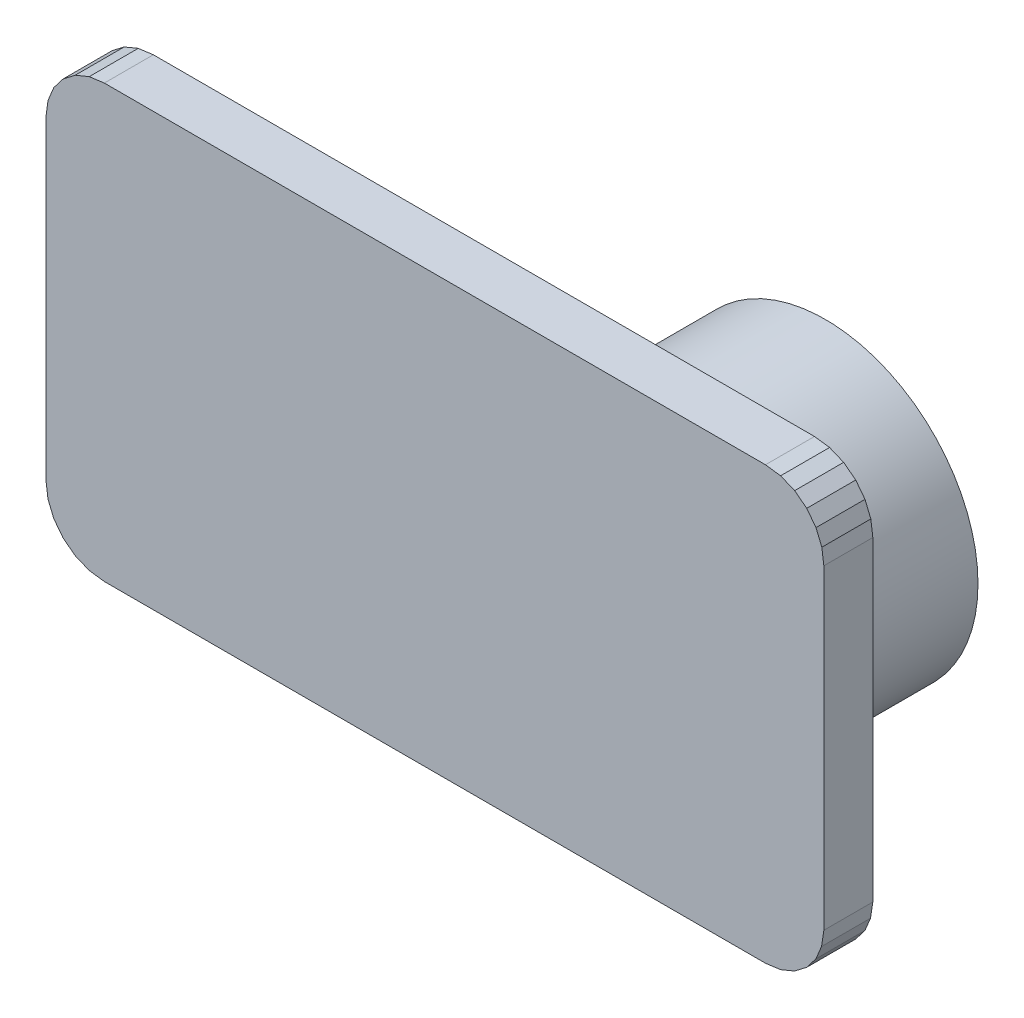
ISO-10303-21;
HEADER;
FILE_DESCRIPTION(('STEP AP214'),'2;1');
FILE_NAME('part.step','',(''),(''),'','','');
FILE_SCHEMA(('AUTOMOTIVE_DESIGN { 1 0 10303 214 1 1 1 1 }'));
ENDSEC;
DATA;
#1=APPLICATION_CONTEXT('core data for automotive mechanical design processes');
#2=APPLICATION_PROTOCOL_DEFINITION('international standard','automotive_design',2000,#1);
#3=PRODUCT_CONTEXT('',#1,'mechanical');
#4=PRODUCT('Part','Part','',(#3));
#5=PRODUCT_RELATED_PRODUCT_CATEGORY('part','',(#4));
#6=PRODUCT_DEFINITION_FORMATION('','',#4);
#7=PRODUCT_DEFINITION_CONTEXT('part definition',#1,'design');
#8=PRODUCT_DEFINITION('design','',#6,#7);
#9=PRODUCT_DEFINITION_SHAPE('','',#8);
#10=(LENGTH_UNIT() NAMED_UNIT(*) SI_UNIT(.MILLI.,.METRE.));
#11=(NAMED_UNIT(*) PLANE_ANGLE_UNIT() SI_UNIT($,.RADIAN.));
#12=(NAMED_UNIT(*) SI_UNIT($,.STERADIAN.) SOLID_ANGLE_UNIT());
#13=UNCERTAINTY_MEASURE_WITH_UNIT(LENGTH_MEASURE(1.E-05),#10,'distance_accuracy_value','');
#14=(GEOMETRIC_REPRESENTATION_CONTEXT(3) GLOBAL_UNCERTAINTY_ASSIGNED_CONTEXT((#13)) GLOBAL_UNIT_ASSIGNED_CONTEXT((#10,
#11,#12)) REPRESENTATION_CONTEXT('',''));
#15=CARTESIAN_POINT('',(0.,0.,0.));
#16=DIRECTION('',(0.,0.,1.));
#17=DIRECTION('',(1.,0.,0.));
#18=AXIS2_PLACEMENT_3D('',#15,#16,#17);
#19=CARTESIAN_POINT('',(0.,0.,0.));
#20=DIRECTION('',(0.,0.,1.));
#21=DIRECTION('',(1.,0.,0.));
#22=AXIS2_PLACEMENT_3D('',#19,#20,#21);
#23=PLANE('',#22);
#24=DIRECTION('',(-0.130525670530028,-0.991444930055465,0.));
#25=VECTOR('',#24,1.);
#26=CARTESIAN_POINT('',(0.064911,12.68505,0.));
#27=LINE('',#26,#25);
#28=CARTESIAN_POINT('',(0.064911,12.68505,0.));
#29=VERTEX_POINT('',#28);
#30=CARTESIAN_POINT('',(0.,12.192,0.));
#31=VERTEX_POINT('',#30);
#32=EDGE_CURVE('E251',#29,#31,#27,.T.);
#33=ORIENTED_EDGE('',*,*,#32,.F.);
#34=DIRECTION('',(-0.382684425736745,-0.923879121042649,0.));
#35=VECTOR('',#34,1.);
#36=CARTESIAN_POINT('',(0.255222,13.1445,0.));
#37=LINE('',#36,#35);
#38=CARTESIAN_POINT('',(0.255222,13.1445,0.));
#39=VERTEX_POINT('',#38);
#40=EDGE_CURVE('E145',#39,#29,#37,.T.);
#41=ORIENTED_EDGE('',*,*,#40,.F.);
#42=DIRECTION('',(-0.608761865423262,-0.793353005418389,0.));
#43=VECTOR('',#42,1.);
#44=CARTESIAN_POINT('',(0.557962,13.539038,0.));
#45=LINE('',#44,#43);
#46=CARTESIAN_POINT('',(0.557962,13.539038,0.));
#47=VERTEX_POINT('',#46);
#48=EDGE_CURVE('E139',#47,#39,#45,.T.);
#49=ORIENTED_EDGE('',*,*,#48,.F.);
#50=DIRECTION('',(-0.79335300541839,-0.608761865423261,0.));
#51=VECTOR('',#50,1.);
#52=CARTESIAN_POINT('',(0.9525,13.841778,0.));
#53=LINE('',#52,#51);
#54=CARTESIAN_POINT('',(0.9525,13.841778,0.));
#55=VERTEX_POINT('',#54);
#56=EDGE_CURVE('E241',#55,#47,#53,.T.);
#57=ORIENTED_EDGE('',*,*,#56,.F.);
#58=DIRECTION('',(-0.923879121042649,-0.382684425736746,0.));
#59=VECTOR('',#58,1.);
#60=CARTESIAN_POINT('',(1.41195,14.032089,0.));
#61=LINE('',#60,#59);
#62=CARTESIAN_POINT('',(1.41195,14.032089,0.));
#63=VERTEX_POINT('',#62);
#64=EDGE_CURVE('E302',#63,#55,#61,.T.);
#65=ORIENTED_EDGE('',*,*,#64,.F.);
#66=DIRECTION('',(-0.991444930055465,-0.13052567053003,0.));
#67=VECTOR('',#66,1.);
#68=CARTESIAN_POINT('',(1.905,14.097,0.));
#69=LINE('',#68,#67);
#70=CARTESIAN_POINT('',(1.905,14.097,0.));
#71=VERTEX_POINT('',#70);
#72=EDGE_CURVE('E300',#71,#63,#69,.T.);
#73=ORIENTED_EDGE('',*,*,#72,.F.);
#74=DIRECTION('',(-1.,0.,0.));
#75=VECTOR('',#74,1.);
#76=CARTESIAN_POINT('',(23.495,14.097,0.));
#77=LINE('',#76,#75);
#78=CARTESIAN_POINT('',(23.495,14.097,0.));
#79=VERTEX_POINT('',#78);
#80=EDGE_CURVE('E298',#79,#71,#77,.T.);
#81=ORIENTED_EDGE('',*,*,#80,.F.);
#82=DIRECTION('',(-0.991444930055465,0.13052567053003,0.));
#83=VECTOR('',#82,1.);
#84=CARTESIAN_POINT('',(23.98805,14.032089,0.));
#85=LINE('',#84,#83);
#86=CARTESIAN_POINT('',(23.98805,14.032089,0.));
#87=VERTEX_POINT('',#86);
#88=EDGE_CURVE('E296',#87,#79,#85,.T.);
#89=ORIENTED_EDGE('',*,*,#88,.F.);
#90=DIRECTION('',(-0.923879121042649,0.382684425736746,0.));
#91=VECTOR('',#90,1.);
#92=CARTESIAN_POINT('',(24.4475,13.841778,0.));
#93=LINE('',#92,#91);
#94=CARTESIAN_POINT('',(24.4475,13.841778,0.));
#95=VERTEX_POINT('',#94);
#96=EDGE_CURVE('E294',#95,#87,#93,.T.);
#97=ORIENTED_EDGE('',*,*,#96,.F.);
#98=DIRECTION('',(-0.793353005418389,0.608761865423261,0.));
#99=VECTOR('',#98,1.);
#100=CARTESIAN_POINT('',(24.842038,13.539038,0.));
#101=LINE('',#100,#99);
#102=CARTESIAN_POINT('',(24.842038,13.539038,0.));
#103=VERTEX_POINT('',#102);
#104=EDGE_CURVE('E292',#103,#95,#101,.T.);
#105=ORIENTED_EDGE('',*,*,#104,.F.);
#106=DIRECTION('',(-0.608761865423261,0.793353005418389,0.));
#107=VECTOR('',#106,1.);
#108=CARTESIAN_POINT('',(25.144778,13.1445,0.));
#109=LINE('',#108,#107);
#110=CARTESIAN_POINT('',(25.144778,13.1445,0.));
#111=VERTEX_POINT('',#110);
#112=EDGE_CURVE('E290',#111,#103,#109,.T.);
#113=ORIENTED_EDGE('',*,*,#112,.F.);
#114=DIRECTION('',(-0.382684425736749,0.923879121042647,0.));
#115=VECTOR('',#114,1.);
#116=CARTESIAN_POINT('',(25.335089,12.68505,0.));
#117=LINE('',#116,#115);
#118=CARTESIAN_POINT('',(25.335089,12.68505,0.));
#119=VERTEX_POINT('',#118);
#120=EDGE_CURVE('E288',#119,#111,#117,.T.);
#121=ORIENTED_EDGE('',*,*,#120,.F.);
#122=DIRECTION('',(-0.130525670530023,0.991444930055466,0.));
#123=VECTOR('',#122,1.);
#124=CARTESIAN_POINT('',(25.4,12.192,0.));
#125=LINE('',#124,#123);
#126=CARTESIAN_POINT('',(25.4,12.192,0.));
#127=VERTEX_POINT('',#126);
#128=EDGE_CURVE('E286',#127,#119,#125,.T.);
#129=ORIENTED_EDGE('',*,*,#128,.F.);
#130=DIRECTION('',(0.,1.,0.));
#131=VECTOR('',#130,1.);
#132=CARTESIAN_POINT('',(25.4,1.905,0.));
#133=LINE('',#132,#131);
#134=CARTESIAN_POINT('',(25.4,1.88478079661536,0.));
#135=VERTEX_POINT('',#134);
#136=EDGE_CURVE('E284',#135,#127,#133,.T.);
#137=ORIENTED_EDGE('',*,*,#136,.F.);
#138=DIRECTION('',(0.148156234238712,0.988963968128366,0.));
#139=VECTOR('',#138,1.);
#140=CARTESIAN_POINT('',(25.3258092025452,1.38954665526113,0.));
#141=LINE('',#140,#139);
#142=CARTESIAN_POINT('',(25.3258092025452,1.38954665526113,0.));
#143=VERTEX_POINT('',#142);
#144=EDGE_CURVE('E281',#143,#135,#141,.T.);
#145=ORIENTED_EDGE('',*,*,#144,.F.);
#146=DIRECTION('',(0.384959142403743,0.922933615532436,0.));
#147=VECTOR('',#146,1.);
#148=CARTESIAN_POINT('',(25.1420464054773,0.948978179242544,0.));
#149=LINE('',#148,#147);
#150=CARTESIAN_POINT('',(25.1420464054773,0.948978179242544,0.));
#151=VERTEX_POINT('',#150);
#152=EDGE_CURVE('E279',#151,#143,#149,.T.);
#153=ORIENTED_EDGE('',*,*,#152,.F.);
#154=DIRECTION('',(0.608724569568057,0.793381622174464,0.));
#155=VECTOR('',#154,1.);
#156=CARTESIAN_POINT('',(25.1420464054773,0.948978179242544,0.));
#157=LINE('',#156,#155);
#158=CARTESIAN_POINT('',(24.842038,0.557962,0.));
#159=VERTEX_POINT('',#158);
#160=EDGE_CURVE('E277',#159,#151,#157,.T.);
#161=ORIENTED_EDGE('',*,*,#160,.F.);
#162=DIRECTION('',(0.793353005418389,0.608761865423262,0.));
#163=VECTOR('',#162,1.);
#164=CARTESIAN_POINT('',(24.842038,0.557962,0.));
#165=LINE('',#164,#163);
#166=CARTESIAN_POINT('',(24.4475,0.255222,0.));
#167=VERTEX_POINT('',#166);
#168=EDGE_CURVE('E275',#167,#159,#165,.T.);
#169=ORIENTED_EDGE('',*,*,#168,.F.);
#170=DIRECTION('',(0.923879121042649,0.382684425736745,0.));
#171=VECTOR('',#170,1.);
#172=CARTESIAN_POINT('',(24.4475,0.255222,0.));
#173=LINE('',#172,#171);
#174=CARTESIAN_POINT('',(23.98805,0.064911,0.));
#175=VERTEX_POINT('',#174);
#176=EDGE_CURVE('E273',#175,#167,#173,.T.);
#177=ORIENTED_EDGE('',*,*,#176,.F.);
#178=DIRECTION('',(0.991444930055465,0.130525670530028,0.));
#179=VECTOR('',#178,1.);
#180=CARTESIAN_POINT('',(23.495,0.,0.));
#181=LINE('',#180,#179);
#182=CARTESIAN_POINT('',(23.495,0.,0.));
#183=VERTEX_POINT('',#182);
#184=EDGE_CURVE('E271',#183,#175,#181,.T.);
#185=ORIENTED_EDGE('',*,*,#184,.F.);
#186=DIRECTION('',(1.,0.,0.));
#187=VECTOR('',#186,1.);
#188=CARTESIAN_POINT('',(1.905,0.,0.));
#189=LINE('',#188,#187);
#190=CARTESIAN_POINT('',(1.905,0.,0.));
#191=VERTEX_POINT('',#190);
#192=EDGE_CURVE('E269',#191,#183,#189,.T.);
#193=ORIENTED_EDGE('',*,*,#192,.F.);
#194=DIRECTION('',(0.991444930055465,-0.130525670530028,0.));
#195=VECTOR('',#194,1.);
#196=CARTESIAN_POINT('',(1.41195,0.064911,0.));
#197=LINE('',#196,#195);
#198=CARTESIAN_POINT('',(1.41195,0.064911,0.));
#199=VERTEX_POINT('',#198);
#200=EDGE_CURVE('E267',#199,#191,#197,.T.);
#201=ORIENTED_EDGE('',*,*,#200,.F.);
#202=DIRECTION('',(0.923879121042649,-0.382684425736745,0.));
#203=VECTOR('',#202,1.);
#204=CARTESIAN_POINT('',(0.9525,0.255222,0.));
#205=LINE('',#204,#203);
#206=CARTESIAN_POINT('',(0.9525,0.255222,0.));
#207=VERTEX_POINT('',#206);
#208=EDGE_CURVE('E265',#207,#199,#205,.T.);
#209=ORIENTED_EDGE('',*,*,#208,.F.);
#210=DIRECTION('',(0.793353005418389,-0.608761865423262,0.));
#211=VECTOR('',#210,1.);
#212=CARTESIAN_POINT('',(0.557962,0.557962,0.));
#213=LINE('',#212,#211);
#214=CARTESIAN_POINT('',(0.557962,0.557962,0.));
#215=VERTEX_POINT('',#214);
#216=EDGE_CURVE('E263',#215,#207,#213,.T.);
#217=ORIENTED_EDGE('',*,*,#216,.F.);
#218=DIRECTION('',(0.608761865423262,-0.793353005418389,0.));
#219=VECTOR('',#218,1.);
#220=CARTESIAN_POINT('',(0.255222,0.9525,0.));
#221=LINE('',#220,#219);
#222=CARTESIAN_POINT('',(0.255222,0.9525,0.));
#223=VERTEX_POINT('',#222);
#224=EDGE_CURVE('E261',#223,#215,#221,.T.);
#225=ORIENTED_EDGE('',*,*,#224,.F.);
#226=DIRECTION('',(0.382684425736745,-0.923879121042649,0.));
#227=VECTOR('',#226,1.);
#228=CARTESIAN_POINT('',(0.064911,1.41195,0.));
#229=LINE('',#228,#227);
#230=CARTESIAN_POINT('',(0.064911,1.41195,0.));
#231=VERTEX_POINT('',#230);
#232=EDGE_CURVE('E259',#231,#223,#229,.T.);
#233=ORIENTED_EDGE('',*,*,#232,.F.);
#234=DIRECTION('',(0.130525670530028,-0.991444930055465,0.));
#235=VECTOR('',#234,1.);
#236=CARTESIAN_POINT('',(0.,1.905,0.));
#237=LINE('',#236,#235);
#238=CARTESIAN_POINT('',(0.,1.905,0.));
#239=VERTEX_POINT('',#238);
#240=EDGE_CURVE('E257',#239,#231,#237,.T.);
#241=ORIENTED_EDGE('',*,*,#240,.F.);
#242=DIRECTION('',(0.,-1.,0.));
#243=VECTOR('',#242,1.);
#244=CARTESIAN_POINT('',(0.,12.192,0.));
#245=LINE('',#244,#243);
#246=EDGE_CURVE('E254',#31,#239,#245,.T.);
#247=ORIENTED_EDGE('',*,*,#246,.F.);
#248=EDGE_LOOP('',(#33,#41,#49,#57,#65,#73,#81,#89,#97,#105,#113,#121,#129,#137,#145,#153,#161,
#169,#177,#185,#193,#201,#209,#217,#225,#233,#241,#247));
#249=FACE_BOUND('',#248,.T.);
#250=CARTESIAN_POINT('',(18.3498365389596,7.10123438435062,0.));
#251=DIRECTION('',(0.,0.,1.));
#252=DIRECTION('',(1.,0.,0.));
#253=AXIS2_PLACEMENT_3D('',#250,#251,#252);
#254=CIRCLE('',#253,4.98501433212418);
#255=CARTESIAN_POINT('',(23.3348508710838,7.10123438435062,0.));
#256=VERTEX_POINT('',#255);
#257=EDGE_CURVE('E11',#256,#256,#254,.F.);
#258=ORIENTED_EDGE('',*,*,#257,.F.);
#259=EDGE_LOOP('',(#258));
#260=FACE_BOUND('',#259,.T.);
#261=ADVANCED_FACE('F33',(#249,#260),#23,.F.);
#262=CARTESIAN_POINT('',(0.064911,12.68505,1.6));
#263=DIRECTION('',(0.991444930055465,-0.130525670530028,0.));
#264=DIRECTION('',(0.130525670530028,0.991444930055465,0.));
#265=AXIS2_PLACEMENT_3D('',#262,#263,#264);
#266=PLANE('',#265);
#267=ORIENTED_EDGE('',*,*,#32,.T.);
#268=DIRECTION('',(0.,0.,-1.));
#269=VECTOR('',#268,1.);
#270=CARTESIAN_POINT('',(0.,12.192,1.6));
#271=LINE('',#270,#269);
#272=CARTESIAN_POINT('',(0.,12.192,1.6));
#273=VERTEX_POINT('',#272);
#274=EDGE_CURVE('E42',#273,#31,#271,.T.);
#275=ORIENTED_EDGE('',*,*,#274,.F.);
#276=DIRECTION('',(-0.130525670530028,-0.991444930055465,0.));
#277=VECTOR('',#276,1.);
#278=CARTESIAN_POINT('',(0.064911,12.68505,1.6));
#279=LINE('',#278,#277);
#280=CARTESIAN_POINT('',(0.064911,12.68505,1.6));
#281=VERTEX_POINT('',#280);
#282=EDGE_CURVE('E307',#281,#273,#279,.T.);
#283=ORIENTED_EDGE('',*,*,#282,.F.);
#284=DIRECTION('',(0.,0.,-1.));
#285=VECTOR('',#284,1.);
#286=CARTESIAN_POINT('',(0.064911,12.68505,1.6));
#287=LINE('',#286,#285);
#288=EDGE_CURVE('E247',#281,#29,#287,.T.);
#289=ORIENTED_EDGE('',*,*,#288,.T.);
#290=EDGE_LOOP('',(#267,#275,#283,#289));
#291=FACE_BOUND('',#290,.T.);
#292=ADVANCED_FACE('F35',(#291),#266,.F.);
#293=CARTESIAN_POINT('',(0.,12.192,1.6));
#294=DIRECTION('',(1.,0.,0.));
#295=DIRECTION('',(0.,0.,-1.));
#296=AXIS2_PLACEMENT_3D('',#293,#294,#295);
#297=PLANE('',#296);
#298=ORIENTED_EDGE('',*,*,#246,.T.);
#299=DIRECTION('',(0.,0.,-1.));
#300=VECTOR('',#299,1.);
#301=CARTESIAN_POINT('',(0.,1.905,1.6));
#302=LINE('',#301,#300);
#303=CARTESIAN_POINT('',(0.,1.905,1.6));
#304=VERTEX_POINT('',#303);
#305=EDGE_CURVE('E377',#304,#239,#302,.T.);
#306=ORIENTED_EDGE('',*,*,#305,.F.);
#307=DIRECTION('',(0.,-1.,0.));
#308=VECTOR('',#307,1.);
#309=CARTESIAN_POINT('',(0.,12.192,1.6));
#310=LINE('',#309,#308);
#311=EDGE_CURVE('E154',#273,#304,#310,.T.);
#312=ORIENTED_EDGE('',*,*,#311,.F.);
#313=ORIENTED_EDGE('',*,*,#274,.T.);
#314=EDGE_LOOP('',(#298,#306,#312,#313));
#315=FACE_BOUND('',#314,.T.);
#316=ADVANCED_FACE('F380',(#315),#297,.F.);
#317=CARTESIAN_POINT('',(0.,1.905,1.6));
#318=DIRECTION('',(0.991444930055465,0.130525670530028,0.));
#319=DIRECTION('',(-0.130525670530028,0.991444930055465,0.));
#320=AXIS2_PLACEMENT_3D('',#317,#318,#319);
#321=PLANE('',#320);
#322=ORIENTED_EDGE('',*,*,#240,.T.);
#323=DIRECTION('',(0.,0.,-1.));
#324=VECTOR('',#323,1.);
#325=CARTESIAN_POINT('',(0.064911,1.41195,1.6));
#326=LINE('',#325,#324);
#327=CARTESIAN_POINT('',(0.064911,1.41195,1.6));
#328=VERTEX_POINT('',#327);
#329=EDGE_CURVE('E374',#328,#231,#326,.T.);
#330=ORIENTED_EDGE('',*,*,#329,.F.);
#331=DIRECTION('',(0.130525670530028,-0.991444930055465,0.));
#332=VECTOR('',#331,1.);
#333=CARTESIAN_POINT('',(0.,1.905,1.6));
#334=LINE('',#333,#332);
#335=EDGE_CURVE('E400',#304,#328,#334,.T.);
#336=ORIENTED_EDGE('',*,*,#335,.F.);
#337=ORIENTED_EDGE('',*,*,#305,.T.);
#338=EDGE_LOOP('',(#322,#330,#336,#337));
#339=FACE_BOUND('',#338,.T.);
#340=ADVANCED_FACE('F391',(#339),#321,.F.);
#341=CARTESIAN_POINT('',(0.064911,1.41195,1.6));
#342=DIRECTION('',(0.923879121042649,0.382684425736745,0.));
#343=DIRECTION('',(-0.382684425736745,0.923879121042649,0.));
#344=AXIS2_PLACEMENT_3D('',#341,#342,#343);
#345=PLANE('',#344);
#346=ORIENTED_EDGE('',*,*,#232,.T.);
#347=DIRECTION('',(0.,0.,-1.));
#348=VECTOR('',#347,1.);
#349=CARTESIAN_POINT('',(0.255222,0.9525,1.6));
#350=LINE('',#349,#348);
#351=CARTESIAN_POINT('',(0.255222,0.9525,1.6));
#352=VERTEX_POINT('',#351);
#353=EDGE_CURVE('E371',#352,#223,#350,.T.);
#354=ORIENTED_EDGE('',*,*,#353,.F.);
#355=DIRECTION('',(0.382684425736745,-0.923879121042649,0.));
#356=VECTOR('',#355,1.);
#357=CARTESIAN_POINT('',(0.064911,1.41195,1.6));
#358=LINE('',#357,#356);
#359=EDGE_CURVE('E397',#328,#352,#358,.T.);
#360=ORIENTED_EDGE('',*,*,#359,.F.);
#361=ORIENTED_EDGE('',*,*,#329,.T.);
#362=EDGE_LOOP('',(#346,#354,#360,#361));
#363=FACE_BOUND('',#362,.T.);
#364=ADVANCED_FACE('F395',(#363),#345,.F.);
#365=CARTESIAN_POINT('',(0.255222,0.9525,1.6));
#366=DIRECTION('',(0.793353005418389,0.608761865423262,0.));
#367=DIRECTION('',(-0.608761865423262,0.793353005418389,0.));
#368=AXIS2_PLACEMENT_3D('',#365,#366,#367);
#369=PLANE('',#368);
#370=ORIENTED_EDGE('',*,*,#224,.T.);
#371=DIRECTION('',(0.,0.,-1.));
#372=VECTOR('',#371,1.);
#373=CARTESIAN_POINT('',(0.557962,0.557962,1.6));
#374=LINE('',#373,#372);
#375=CARTESIAN_POINT('',(0.557962,0.557962,1.6));
#376=VERTEX_POINT('',#375);
#377=EDGE_CURVE('E368',#376,#215,#374,.T.);
#378=ORIENTED_EDGE('',*,*,#377,.F.);
#379=DIRECTION('',(0.608761865423262,-0.793353005418389,0.));
#380=VECTOR('',#379,1.);
#381=CARTESIAN_POINT('',(0.255222,0.9525,1.6));
#382=LINE('',#381,#380);
#383=EDGE_CURVE('E399',#352,#376,#382,.T.);
#384=ORIENTED_EDGE('',*,*,#383,.F.);
#385=ORIENTED_EDGE('',*,*,#353,.T.);
#386=EDGE_LOOP('',(#370,#378,#384,#385));
#387=FACE_BOUND('',#386,.T.);
#388=ADVANCED_FACE('F542',(#387),#369,.F.);
#389=CARTESIAN_POINT('',(0.557962,0.557962,1.6));
#390=DIRECTION('',(0.608761865423262,0.793353005418389,0.));
#391=DIRECTION('',(-0.793353005418389,0.608761865423262,0.));
#392=AXIS2_PLACEMENT_3D('',#389,#390,#391);
#393=PLANE('',#392);
#394=ORIENTED_EDGE('',*,*,#216,.T.);
#395=DIRECTION('',(0.,0.,-1.));
#396=VECTOR('',#395,1.);
#397=CARTESIAN_POINT('',(0.9525,0.255222,1.6));
#398=LINE('',#397,#396);
#399=CARTESIAN_POINT('',(0.9525,0.255222,1.6));
#400=VERTEX_POINT('',#399);
#401=EDGE_CURVE('E365',#400,#207,#398,.T.);
#402=ORIENTED_EDGE('',*,*,#401,.F.);
#403=DIRECTION('',(0.793353005418389,-0.608761865423262,0.));
#404=VECTOR('',#403,1.);
#405=CARTESIAN_POINT('',(0.557962,0.557962,1.6));
#406=LINE('',#405,#404);
#407=EDGE_CURVE('E402',#376,#400,#406,.T.);
#408=ORIENTED_EDGE('',*,*,#407,.F.);
#409=ORIENTED_EDGE('',*,*,#377,.T.);
#410=EDGE_LOOP('',(#394,#402,#408,#409));
#411=FACE_BOUND('',#410,.T.);
#412=ADVANCED_FACE('F539',(#411),#393,.F.);
#413=CARTESIAN_POINT('',(0.9525,0.255222,1.6));
#414=DIRECTION('',(0.382684425736745,0.923879121042649,0.));
#415=DIRECTION('',(-0.923879121042649,0.382684425736745,0.));
#416=AXIS2_PLACEMENT_3D('',#413,#414,#415);
#417=PLANE('',#416);
#418=ORIENTED_EDGE('',*,*,#208,.T.);
#419=DIRECTION('',(0.,0.,-1.));
#420=VECTOR('',#419,1.);
#421=CARTESIAN_POINT('',(1.41195,0.064911,1.6));
#422=LINE('',#421,#420);
#423=CARTESIAN_POINT('',(1.41195,0.064911,1.6));
#424=VERTEX_POINT('',#423);
#425=EDGE_CURVE('E362',#424,#199,#422,.T.);
#426=ORIENTED_EDGE('',*,*,#425,.F.);
#427=DIRECTION('',(0.923879121042649,-0.382684425736745,0.));
#428=VECTOR('',#427,1.);
#429=CARTESIAN_POINT('',(0.9525,0.255222,1.6));
#430=LINE('',#429,#428);
#431=EDGE_CURVE('E408',#400,#424,#430,.T.);
#432=ORIENTED_EDGE('',*,*,#431,.F.);
#433=ORIENTED_EDGE('',*,*,#401,.T.);
#434=EDGE_LOOP('',(#418,#426,#432,#433));
#435=FACE_BOUND('',#434,.T.);
#436=ADVANCED_FACE('F535',(#435),#417,.F.);
#437=CARTESIAN_POINT('',(1.41195,0.064911,1.6));
#438=DIRECTION('',(0.130525670530028,0.991444930055465,0.));
#439=DIRECTION('',(-0.991444930055465,0.130525670530028,0.));
#440=AXIS2_PLACEMENT_3D('',#437,#438,#439);
#441=PLANE('',#440);
#442=ORIENTED_EDGE('',*,*,#200,.T.);
#443=DIRECTION('',(0.,0.,-1.));
#444=VECTOR('',#443,1.);
#445=CARTESIAN_POINT('',(1.905,0.,1.6));
#446=LINE('',#445,#444);
#447=CARTESIAN_POINT('',(1.905,0.,1.6));
#448=VERTEX_POINT('',#447);
#449=EDGE_CURVE('E359',#448,#191,#446,.T.);
#450=ORIENTED_EDGE('',*,*,#449,.F.);
#451=DIRECTION('',(0.991444930055465,-0.130525670530028,0.));
#452=VECTOR('',#451,1.);
#453=CARTESIAN_POINT('',(1.41195,0.064911,1.6));
#454=LINE('',#453,#452);
#455=EDGE_CURVE('E410',#424,#448,#454,.T.);
#456=ORIENTED_EDGE('',*,*,#455,.F.);
#457=ORIENTED_EDGE('',*,*,#425,.T.);
#458=EDGE_LOOP('',(#442,#450,#456,#457));
#459=FACE_BOUND('',#458,.T.);
#460=ADVANCED_FACE('F530',(#459),#441,.F.);
#461=CARTESIAN_POINT('',(1.905,0.,1.6));
#462=DIRECTION('',(0.,1.,0.));
#463=DIRECTION('',(0.,0.,1.));
#464=AXIS2_PLACEMENT_3D('',#461,#462,#463);
#465=PLANE('',#464);
#466=ORIENTED_EDGE('',*,*,#192,.T.);
#467=DIRECTION('',(0.,0.,-1.));
#468=VECTOR('',#467,1.);
#469=CARTESIAN_POINT('',(23.495,0.,1.6));
#470=LINE('',#469,#468);
#471=CARTESIAN_POINT('',(23.495,0.,1.6));
#472=VERTEX_POINT('',#471);
#473=EDGE_CURVE('E356',#472,#183,#470,.T.);
#474=ORIENTED_EDGE('',*,*,#473,.F.);
#475=DIRECTION('',(1.,0.,0.));
#476=VECTOR('',#475,1.);
#477=CARTESIAN_POINT('',(1.905,0.,1.6));
#478=LINE('',#477,#476);
#479=EDGE_CURVE('E412',#448,#472,#478,.T.);
#480=ORIENTED_EDGE('',*,*,#479,.F.);
#481=ORIENTED_EDGE('',*,*,#449,.T.);
#482=EDGE_LOOP('',(#466,#474,#480,#481));
#483=FACE_BOUND('',#482,.T.);
#484=ADVANCED_FACE('F524',(#483),#465,.F.);
#485=CARTESIAN_POINT('',(23.495,0.,1.6));
#486=DIRECTION('',(-0.130525670530028,0.991444930055465,0.));
#487=DIRECTION('',(-0.991444930055465,-0.130525670530028,0.));
#488=AXIS2_PLACEMENT_3D('',#485,#486,#487);
#489=PLANE('',#488);
#490=ORIENTED_EDGE('',*,*,#184,.T.);
#491=DIRECTION('',(0.,0.,-1.));
#492=VECTOR('',#491,1.);
#493=CARTESIAN_POINT('',(23.98805,0.064911,1.6));
#494=LINE('',#493,#492);
#495=CARTESIAN_POINT('',(23.98805,0.064911,1.6));
#496=VERTEX_POINT('',#495);
#497=EDGE_CURVE('E353',#496,#175,#494,.T.);
#498=ORIENTED_EDGE('',*,*,#497,.F.);
#499=DIRECTION('',(0.991444930055465,0.130525670530028,0.));
#500=VECTOR('',#499,1.);
#501=CARTESIAN_POINT('',(23.495,0.,1.6));
#502=LINE('',#501,#500);
#503=EDGE_CURVE('E414',#472,#496,#502,.T.);
#504=ORIENTED_EDGE('',*,*,#503,.F.);
#505=ORIENTED_EDGE('',*,*,#473,.T.);
#506=EDGE_LOOP('',(#490,#498,#504,#505));
#507=FACE_BOUND('',#506,.T.);
#508=ADVANCED_FACE('F520',(#507),#489,.F.);
#509=CARTESIAN_POINT('',(24.4475,0.255222,1.6));
#510=DIRECTION('',(-0.382684425736745,0.923879121042649,0.));
#511=DIRECTION('',(-0.923879121042649,-0.382684425736745,0.));
#512=AXIS2_PLACEMENT_3D('',#509,#510,#511);
#513=PLANE('',#512);
#514=ORIENTED_EDGE('',*,*,#176,.T.);
#515=DIRECTION('',(0.,0.,-1.));
#516=VECTOR('',#515,1.);
#517=CARTESIAN_POINT('',(24.4475,0.255222,1.6));
#518=LINE('',#517,#516);
#519=CARTESIAN_POINT('',(24.4475,0.255222,1.6));
#520=VERTEX_POINT('',#519);
#521=EDGE_CURVE('E350',#520,#167,#518,.T.);
#522=ORIENTED_EDGE('',*,*,#521,.F.);
#523=DIRECTION('',(0.923879121042649,0.382684425736745,0.));
#524=VECTOR('',#523,1.);
#525=CARTESIAN_POINT('',(24.4475,0.255222,1.6));
#526=LINE('',#525,#524);
#527=EDGE_CURVE('E416',#496,#520,#526,.T.);
#528=ORIENTED_EDGE('',*,*,#527,.F.);
#529=ORIENTED_EDGE('',*,*,#497,.T.);
#530=EDGE_LOOP('',(#514,#522,#528,#529));
#531=FACE_BOUND('',#530,.T.);
#532=ADVANCED_FACE('F515',(#531),#513,.F.);
#533=CARTESIAN_POINT('',(24.842038,0.557962,1.6));
#534=DIRECTION('',(-0.608761865423262,0.793353005418389,0.));
#535=DIRECTION('',(-0.793353005418389,-0.608761865423262,0.));
#536=AXIS2_PLACEMENT_3D('',#533,#534,#535);
#537=PLANE('',#536);
#538=ORIENTED_EDGE('',*,*,#168,.T.);
#539=DIRECTION('',(0.,0.,-1.));
#540=VECTOR('',#539,1.);
#541=CARTESIAN_POINT('',(24.842038,0.557962,1.6));
#542=LINE('',#541,#540);
#543=CARTESIAN_POINT('',(24.842038,0.557962,1.6));
#544=VERTEX_POINT('',#543);
#545=EDGE_CURVE('E347',#544,#159,#542,.T.);
#546=ORIENTED_EDGE('',*,*,#545,.F.);
#547=DIRECTION('',(0.793353005418389,0.608761865423262,0.));
#548=VECTOR('',#547,1.);
#549=CARTESIAN_POINT('',(24.842038,0.557962,1.6));
#550=LINE('',#549,#548);
#551=EDGE_CURVE('E418',#520,#544,#550,.T.);
#552=ORIENTED_EDGE('',*,*,#551,.F.);
#553=ORIENTED_EDGE('',*,*,#521,.T.);
#554=EDGE_LOOP('',(#538,#546,#552,#553));
#555=FACE_BOUND('',#554,.T.);
#556=ADVANCED_FACE('F509',(#555),#537,.F.);
#557=CARTESIAN_POINT('',(25.1420464054773,0.948978179242544,1.6));
#558=DIRECTION('',(-0.793381622174464,0.608724569568057,0.));
#559=DIRECTION('',(-0.608724569568057,-0.793381622174464,0.));
#560=AXIS2_PLACEMENT_3D('',#557,#558,#559);
#561=PLANE('',#560);
#562=ORIENTED_EDGE('',*,*,#160,.T.);
#563=DIRECTION('',(0.,0.,-1.));
#564=VECTOR('',#563,1.);
#565=CARTESIAN_POINT('',(25.1420464054773,0.948978179242544,1.6));
#566=LINE('',#565,#564);
#567=CARTESIAN_POINT('',(25.1420464054773,0.948978179242544,1.6));
#568=VERTEX_POINT('',#567);
#569=EDGE_CURVE('E344',#568,#151,#566,.T.);
#570=ORIENTED_EDGE('',*,*,#569,.F.);
#571=DIRECTION('',(0.608724569568057,0.793381622174464,0.));
#572=VECTOR('',#571,1.);
#573=CARTESIAN_POINT('',(25.1420464054773,0.948978179242544,1.6));
#574=LINE('',#573,#572);
#575=EDGE_CURVE('E420',#544,#568,#574,.T.);
#576=ORIENTED_EDGE('',*,*,#575,.F.);
#577=ORIENTED_EDGE('',*,*,#545,.T.);
#578=EDGE_LOOP('',(#562,#570,#576,#577));
#579=FACE_BOUND('',#578,.T.);
#580=ADVANCED_FACE('F505',(#579),#561,.F.);
#581=CARTESIAN_POINT('',(25.1420464054773,0.948978179242544,1.6));
#582=DIRECTION('',(-0.922933615532436,0.384959142403743,0.));
#583=DIRECTION('',(-0.384959142403743,-0.922933615532436,0.));
#584=AXIS2_PLACEMENT_3D('',#581,#582,#583);
#585=PLANE('',#584);
#586=ORIENTED_EDGE('',*,*,#152,.T.);
#587=DIRECTION('',(0.,0.,-1.));
#588=VECTOR('',#587,1.);
#589=CARTESIAN_POINT('',(25.3258092025452,1.38954665526113,1.6));
#590=LINE('',#589,#588);
#591=CARTESIAN_POINT('',(25.3258092025452,1.38954665526113,1.6));
#592=VERTEX_POINT('',#591);
#593=EDGE_CURVE('E341',#592,#143,#590,.T.);
#594=ORIENTED_EDGE('',*,*,#593,.F.);
#595=DIRECTION('',(0.384959142403743,0.922933615532436,0.));
#596=VECTOR('',#595,1.);
#597=CARTESIAN_POINT('',(25.1420464054773,0.948978179242544,1.6));
#598=LINE('',#597,#596);
#599=EDGE_CURVE('E422',#568,#592,#598,.T.);
#600=ORIENTED_EDGE('',*,*,#599,.F.);
#601=ORIENTED_EDGE('',*,*,#569,.T.);
#602=EDGE_LOOP('',(#586,#594,#600,#601));
#603=FACE_BOUND('',#602,.T.);
#604=ADVANCED_FACE('F500',(#603),#585,.F.);
#605=CARTESIAN_POINT('',(25.3258092025452,1.38954665526113,1.6));
#606=DIRECTION('',(-0.988963968128366,0.148156234238712,0.));
#607=DIRECTION('',(-0.148156234238712,-0.988963968128366,0.));
#608=AXIS2_PLACEMENT_3D('',#605,#606,#607);
#609=PLANE('',#608);
#610=ORIENTED_EDGE('',*,*,#144,.T.);
#611=DIRECTION('',(0.,0.,-1.));
#612=VECTOR('',#611,1.);
#613=CARTESIAN_POINT('',(25.4,1.88478079661536,1.6));
#614=LINE('',#613,#612);
#615=CARTESIAN_POINT('',(25.4,1.88478079661536,1.6));
#616=VERTEX_POINT('',#615);
#617=EDGE_CURVE('E338',#616,#135,#614,.T.);
#618=ORIENTED_EDGE('',*,*,#617,.F.);
#619=DIRECTION('',(0.148156234238712,0.988963968128366,0.));
#620=VECTOR('',#619,1.);
#621=CARTESIAN_POINT('',(25.3258092025452,1.38954665526113,1.6));
#622=LINE('',#621,#620);
#623=EDGE_CURVE('E424',#592,#616,#622,.T.);
#624=ORIENTED_EDGE('',*,*,#623,.F.);
#625=ORIENTED_EDGE('',*,*,#593,.T.);
#626=EDGE_LOOP('',(#610,#618,#624,#625));
#627=FACE_BOUND('',#626,.T.);
#628=ADVANCED_FACE('F494',(#627),#609,.F.);
#629=CARTESIAN_POINT('',(25.4,1.905,1.6));
#630=DIRECTION('',(-1.,0.,0.));
#631=DIRECTION('',(0.,0.,1.));
#632=AXIS2_PLACEMENT_3D('',#629,#630,#631);
#633=PLANE('',#632);
#634=ORIENTED_EDGE('',*,*,#136,.T.);
#635=DIRECTION('',(0.,0.,-1.));
#636=VECTOR('',#635,1.);
#637=CARTESIAN_POINT('',(25.4,12.192,1.6));
#638=LINE('',#637,#636);
#639=CARTESIAN_POINT('',(25.4,12.192,1.6));
#640=VERTEX_POINT('',#639);
#641=EDGE_CURVE('E335',#640,#127,#638,.T.);
#642=ORIENTED_EDGE('',*,*,#641,.F.);
#643=DIRECTION('',(0.,1.,0.));
#644=VECTOR('',#643,1.);
#645=CARTESIAN_POINT('',(25.4,1.88478079661536,1.6));
#646=LINE('',#645,#644);
#647=EDGE_CURVE('E426',#616,#640,#646,.T.);
#648=ORIENTED_EDGE('',*,*,#647,.F.);
#649=ORIENTED_EDGE('',*,*,#617,.T.);
#650=EDGE_LOOP('',(#634,#642,#648,#649));
#651=FACE_BOUND('',#650,.T.);
#652=ADVANCED_FACE('F490',(#651),#633,.F.);
#653=CARTESIAN_POINT('',(25.4,12.192,1.6));
#654=DIRECTION('',(-0.991444930055466,-0.130525670530023,0.));
#655=DIRECTION('',(0.130525670530023,-0.991444930055466,0.));
#656=AXIS2_PLACEMENT_3D('',#653,#654,#655);
#657=PLANE('',#656);
#658=ORIENTED_EDGE('',*,*,#128,.T.);
#659=DIRECTION('',(0.,0.,-1.));
#660=VECTOR('',#659,1.);
#661=CARTESIAN_POINT('',(25.335089,12.68505,1.6));
#662=LINE('',#661,#660);
#663=CARTESIAN_POINT('',(25.335089,12.68505,1.6));
#664=VERTEX_POINT('',#663);
#665=EDGE_CURVE('E332',#664,#119,#662,.T.);
#666=ORIENTED_EDGE('',*,*,#665,.F.);
#667=DIRECTION('',(-0.130525670530023,0.991444930055466,0.));
#668=VECTOR('',#667,1.);
#669=CARTESIAN_POINT('',(25.4,12.192,1.6));
#670=LINE('',#669,#668);
#671=EDGE_CURVE('E428',#640,#664,#670,.T.);
#672=ORIENTED_EDGE('',*,*,#671,.F.);
#673=ORIENTED_EDGE('',*,*,#641,.T.);
#674=EDGE_LOOP('',(#658,#666,#672,#673));
#675=FACE_BOUND('',#674,.T.);
#676=ADVANCED_FACE('F485',(#675),#657,.F.);
#677=CARTESIAN_POINT('',(25.335089,12.68505,1.6));
#678=DIRECTION('',(-0.923879121042647,-0.382684425736749,0.));
#679=DIRECTION('',(0.382684425736749,-0.923879121042647,0.));
#680=AXIS2_PLACEMENT_3D('',#677,#678,#679);
#681=PLANE('',#680);
#682=ORIENTED_EDGE('',*,*,#120,.T.);
#683=DIRECTION('',(0.,0.,-1.));
#684=VECTOR('',#683,1.);
#685=CARTESIAN_POINT('',(25.144778,13.1445,1.6));
#686=LINE('',#685,#684);
#687=CARTESIAN_POINT('',(25.144778,13.1445,1.6));
#688=VERTEX_POINT('',#687);
#689=EDGE_CURVE('E329',#688,#111,#686,.T.);
#690=ORIENTED_EDGE('',*,*,#689,.F.);
#691=DIRECTION('',(-0.382684425736749,0.923879121042647,0.));
#692=VECTOR('',#691,1.);
#693=CARTESIAN_POINT('',(25.335089,12.68505,1.6));
#694=LINE('',#693,#692);
#695=EDGE_CURVE('E430',#664,#688,#694,.T.);
#696=ORIENTED_EDGE('',*,*,#695,.F.);
#697=ORIENTED_EDGE('',*,*,#665,.T.);
#698=EDGE_LOOP('',(#682,#690,#696,#697));
#699=FACE_BOUND('',#698,.T.);
#700=ADVANCED_FACE('F480',(#699),#681,.F.);
#701=CARTESIAN_POINT('',(25.144778,13.1445,1.6));
#702=DIRECTION('',(-0.793353005418389,-0.608761865423261,0.));
#703=DIRECTION('',(0.608761865423261,-0.793353005418389,0.));
#704=AXIS2_PLACEMENT_3D('',#701,#702,#703);
#705=PLANE('',#704);
#706=ORIENTED_EDGE('',*,*,#112,.T.);
#707=DIRECTION('',(0.,0.,-1.));
#708=VECTOR('',#707,1.);
#709=CARTESIAN_POINT('',(24.842038,13.539038,1.6));
#710=LINE('',#709,#708);
#711=CARTESIAN_POINT('',(24.842038,13.539038,1.6));
#712=VERTEX_POINT('',#711);
#713=EDGE_CURVE('E326',#712,#103,#710,.T.);
#714=ORIENTED_EDGE('',*,*,#713,.F.);
#715=DIRECTION('',(-0.608761865423261,0.793353005418389,0.));
#716=VECTOR('',#715,1.);
#717=CARTESIAN_POINT('',(25.144778,13.1445,1.6));
#718=LINE('',#717,#716);
#719=EDGE_CURVE('E432',#688,#712,#718,.T.);
#720=ORIENTED_EDGE('',*,*,#719,.F.);
#721=ORIENTED_EDGE('',*,*,#689,.T.);
#722=EDGE_LOOP('',(#706,#714,#720,#721));
#723=FACE_BOUND('',#722,.T.);
#724=ADVANCED_FACE('F476',(#723),#705,.F.);
#725=CARTESIAN_POINT('',(24.842038,13.539038,1.6));
#726=DIRECTION('',(-0.608761865423261,-0.793353005418389,0.));
#727=DIRECTION('',(0.793353005418389,-0.608761865423261,0.));
#728=AXIS2_PLACEMENT_3D('',#725,#726,#727);
#729=PLANE('',#728);
#730=ORIENTED_EDGE('',*,*,#104,.T.);
#731=DIRECTION('',(0.,0.,-1.));
#732=VECTOR('',#731,1.);
#733=CARTESIAN_POINT('',(24.4475,13.841778,1.6));
#734=LINE('',#733,#732);
#735=CARTESIAN_POINT('',(24.4475,13.841778,1.6));
#736=VERTEX_POINT('',#735);
#737=EDGE_CURVE('E323',#736,#95,#734,.T.);
#738=ORIENTED_EDGE('',*,*,#737,.F.);
#739=DIRECTION('',(-0.793353005418389,0.608761865423261,0.));
#740=VECTOR('',#739,1.);
#741=CARTESIAN_POINT('',(24.842038,13.539038,1.6));
#742=LINE('',#741,#740);
#743=EDGE_CURVE('E434',#712,#736,#742,.T.);
#744=ORIENTED_EDGE('',*,*,#743,.F.);
#745=ORIENTED_EDGE('',*,*,#713,.T.);
#746=EDGE_LOOP('',(#730,#738,#744,#745));
#747=FACE_BOUND('',#746,.T.);
#748=ADVANCED_FACE('F471',(#747),#729,.F.);
#749=CARTESIAN_POINT('',(24.4475,13.841778,1.6));
#750=DIRECTION('',(-0.382684425736746,-0.923879121042649,0.));
#751=DIRECTION('',(0.923879121042649,-0.382684425736746,0.));
#752=AXIS2_PLACEMENT_3D('',#749,#750,#751);
#753=PLANE('',#752);
#754=ORIENTED_EDGE('',*,*,#96,.T.);
#755=DIRECTION('',(0.,0.,-1.));
#756=VECTOR('',#755,1.);
#757=CARTESIAN_POINT('',(23.98805,14.032089,1.6));
#758=LINE('',#757,#756);
#759=CARTESIAN_POINT('',(23.98805,14.032089,1.6));
#760=VERTEX_POINT('',#759);
#761=EDGE_CURVE('E320',#760,#87,#758,.T.);
#762=ORIENTED_EDGE('',*,*,#761,.F.);
#763=DIRECTION('',(-0.923879121042649,0.382684425736746,0.));
#764=VECTOR('',#763,1.);
#765=CARTESIAN_POINT('',(24.4475,13.841778,1.6));
#766=LINE('',#765,#764);
#767=EDGE_CURVE('E436',#736,#760,#766,.T.);
#768=ORIENTED_EDGE('',*,*,#767,.F.);
#769=ORIENTED_EDGE('',*,*,#737,.T.);
#770=EDGE_LOOP('',(#754,#762,#768,#769));
#771=FACE_BOUND('',#770,.T.);
#772=ADVANCED_FACE('F465',(#771),#753,.F.);
#773=CARTESIAN_POINT('',(23.98805,14.032089,1.6));
#774=DIRECTION('',(-0.13052567053003,-0.991444930055465,0.));
#775=DIRECTION('',(0.991444930055465,-0.13052567053003,0.));
#776=AXIS2_PLACEMENT_3D('',#773,#774,#775);
#777=PLANE('',#776);
#778=ORIENTED_EDGE('',*,*,#88,.T.);
#779=DIRECTION('',(0.,0.,-1.));
#780=VECTOR('',#779,1.);
#781=CARTESIAN_POINT('',(23.495,14.097,1.6));
#782=LINE('',#781,#780);
#783=CARTESIAN_POINT('',(23.495,14.097,1.6));
#784=VERTEX_POINT('',#783);
#785=EDGE_CURVE('E317',#784,#79,#782,.T.);
#786=ORIENTED_EDGE('',*,*,#785,.F.);
#787=DIRECTION('',(-0.991444930055465,0.13052567053003,0.));
#788=VECTOR('',#787,1.);
#789=CARTESIAN_POINT('',(23.98805,14.032089,1.6));
#790=LINE('',#789,#788);
#791=EDGE_CURVE('E438',#760,#784,#790,.T.);
#792=ORIENTED_EDGE('',*,*,#791,.F.);
#793=ORIENTED_EDGE('',*,*,#761,.T.);
#794=EDGE_LOOP('',(#778,#786,#792,#793));
#795=FACE_BOUND('',#794,.T.);
#796=ADVANCED_FACE('F461',(#795),#777,.F.);
#797=CARTESIAN_POINT('',(23.495,14.097,1.6));
#798=DIRECTION('',(0.,-1.,0.));
#799=DIRECTION('',(0.,0.,-1.));
#800=AXIS2_PLACEMENT_3D('',#797,#798,#799);
#801=PLANE('',#800);
#802=ORIENTED_EDGE('',*,*,#80,.T.);
#803=DIRECTION('',(0.,0.,-1.));
#804=VECTOR('',#803,1.);
#805=CARTESIAN_POINT('',(1.905,14.097,1.6));
#806=LINE('',#805,#804);
#807=CARTESIAN_POINT('',(1.905,14.097,1.6));
#808=VERTEX_POINT('',#807);
#809=EDGE_CURVE('E314',#808,#71,#806,.T.);
#810=ORIENTED_EDGE('',*,*,#809,.F.);
#811=DIRECTION('',(-1.,0.,0.));
#812=VECTOR('',#811,1.);
#813=CARTESIAN_POINT('',(23.495,14.097,1.6));
#814=LINE('',#813,#812);
#815=EDGE_CURVE('E440',#784,#808,#814,.T.);
#816=ORIENTED_EDGE('',*,*,#815,.F.);
#817=ORIENTED_EDGE('',*,*,#785,.T.);
#818=EDGE_LOOP('',(#802,#810,#816,#817));
#819=FACE_BOUND('',#818,.T.);
#820=ADVANCED_FACE('F457',(#819),#801,.F.);
#821=CARTESIAN_POINT('',(1.905,14.097,1.6));
#822=DIRECTION('',(0.13052567053003,-0.991444930055465,0.));
#823=DIRECTION('',(0.991444930055465,0.13052567053003,0.));
#824=AXIS2_PLACEMENT_3D('',#821,#822,#823);
#825=PLANE('',#824);
#826=ORIENTED_EDGE('',*,*,#72,.T.);
#827=DIRECTION('',(0.,0.,-1.));
#828=VECTOR('',#827,1.);
#829=CARTESIAN_POINT('',(1.41195,14.032089,1.6));
#830=LINE('',#829,#828);
#831=CARTESIAN_POINT('',(1.41195,14.032089,1.6));
#832=VERTEX_POINT('',#831);
#833=EDGE_CURVE('E311',#832,#63,#830,.T.);
#834=ORIENTED_EDGE('',*,*,#833,.F.);
#835=DIRECTION('',(-0.991444930055465,-0.13052567053003,0.));
#836=VECTOR('',#835,1.);
#837=CARTESIAN_POINT('',(1.905,14.097,1.6));
#838=LINE('',#837,#836);
#839=EDGE_CURVE('E442',#808,#832,#838,.T.);
#840=ORIENTED_EDGE('',*,*,#839,.F.);
#841=ORIENTED_EDGE('',*,*,#809,.T.);
#842=EDGE_LOOP('',(#826,#834,#840,#841));
#843=FACE_BOUND('',#842,.T.);
#844=ADVANCED_FACE('F448',(#843),#825,.F.);
#845=CARTESIAN_POINT('',(1.41195,14.032089,1.6));
#846=DIRECTION('',(0.382684425736746,-0.923879121042649,0.));
#847=DIRECTION('',(0.923879121042649,0.382684425736746,0.));
#848=AXIS2_PLACEMENT_3D('',#845,#846,#847);
#849=PLANE('',#848);
#850=ORIENTED_EDGE('',*,*,#64,.T.);
#851=DIRECTION('',(0.,0.,-1.));
#852=VECTOR('',#851,1.);
#853=CARTESIAN_POINT('',(0.9525,13.841778,1.6));
#854=LINE('',#853,#852);
#855=CARTESIAN_POINT('',(0.9525,13.841778,1.6));
#856=VERTEX_POINT('',#855);
#857=EDGE_CURVE('E242',#856,#55,#854,.T.);
#858=ORIENTED_EDGE('',*,*,#857,.F.);
#859=DIRECTION('',(-0.923879121042649,-0.382684425736746,0.));
#860=VECTOR('',#859,1.);
#861=CARTESIAN_POINT('',(1.41195,14.032089,1.6));
#862=LINE('',#861,#860);
#863=EDGE_CURVE('E233',#832,#856,#862,.T.);
#864=ORIENTED_EDGE('',*,*,#863,.F.);
#865=ORIENTED_EDGE('',*,*,#833,.T.);
#866=EDGE_LOOP('',(#850,#858,#864,#865));
#867=FACE_BOUND('',#866,.T.);
#868=ADVANCED_FACE('F452',(#867),#849,.F.);
#869=CARTESIAN_POINT('',(0.9525,13.841778,1.6));
#870=DIRECTION('',(0.608761865423261,-0.79335300541839,0.));
#871=DIRECTION('',(0.79335300541839,0.608761865423261,0.));
#872=AXIS2_PLACEMENT_3D('',#869,#870,#871);
#873=PLANE('',#872);
#874=ORIENTED_EDGE('',*,*,#56,.T.);
#875=DIRECTION('',(0.,0.,-1.));
#876=VECTOR('',#875,1.);
#877=CARTESIAN_POINT('',(0.557962,13.539038,1.6));
#878=LINE('',#877,#876);
#879=CARTESIAN_POINT('',(0.557962,13.539038,1.6));
#880=VERTEX_POINT('',#879);
#881=EDGE_CURVE('E238',#880,#47,#878,.T.);
#882=ORIENTED_EDGE('',*,*,#881,.F.);
#883=DIRECTION('',(-0.79335300541839,-0.608761865423261,0.));
#884=VECTOR('',#883,1.);
#885=CARTESIAN_POINT('',(0.9525,13.841778,1.6));
#886=LINE('',#885,#884);
#887=EDGE_CURVE('E227',#856,#880,#886,.T.);
#888=ORIENTED_EDGE('',*,*,#887,.F.);
#889=ORIENTED_EDGE('',*,*,#857,.T.);
#890=EDGE_LOOP('',(#874,#882,#888,#889));
#891=FACE_BOUND('',#890,.T.);
#892=ADVANCED_FACE('F239',(#891),#873,.F.);
#893=CARTESIAN_POINT('',(0.557962,13.539038,1.6));
#894=DIRECTION('',(0.793353005418389,-0.608761865423262,0.));
#895=DIRECTION('',(0.608761865423262,0.793353005418389,0.));
#896=AXIS2_PLACEMENT_3D('',#893,#894,#895);
#897=PLANE('',#896);
#898=ORIENTED_EDGE('',*,*,#48,.T.);
#899=DIRECTION('',(0.,0.,-1.));
#900=VECTOR('',#899,1.);
#901=CARTESIAN_POINT('',(0.255222,13.1445,1.6));
#902=LINE('',#901,#900);
#903=CARTESIAN_POINT('',(0.255222,13.1445,1.6));
#904=VERTEX_POINT('',#903);
#905=EDGE_CURVE('E243',#904,#39,#902,.T.);
#906=ORIENTED_EDGE('',*,*,#905,.F.);
#907=DIRECTION('',(-0.608761865423262,-0.793353005418389,0.));
#908=VECTOR('',#907,1.);
#909=CARTESIAN_POINT('',(0.557962,13.539038,1.6));
#910=LINE('',#909,#908);
#911=EDGE_CURVE('E231',#880,#904,#910,.T.);
#912=ORIENTED_EDGE('',*,*,#911,.F.);
#913=ORIENTED_EDGE('',*,*,#881,.T.);
#914=EDGE_LOOP('',(#898,#906,#912,#913));
#915=FACE_BOUND('',#914,.T.);
#916=ADVANCED_FACE('F245',(#915),#897,.F.);
#917=CARTESIAN_POINT('',(0.255222,13.1445,1.6));
#918=DIRECTION('',(0.923879121042649,-0.382684425736745,0.));
#919=DIRECTION('',(0.382684425736745,0.923879121042649,0.));
#920=AXIS2_PLACEMENT_3D('',#917,#918,#919);
#921=PLANE('',#920);
#922=ORIENTED_EDGE('',*,*,#40,.T.);
#923=ORIENTED_EDGE('',*,*,#288,.F.);
#924=DIRECTION('',(-0.382684425736745,-0.923879121042649,0.));
#925=VECTOR('',#924,1.);
#926=CARTESIAN_POINT('',(0.255222,13.1445,1.6));
#927=LINE('',#926,#925);
#928=EDGE_CURVE('E50',#904,#281,#927,.T.);
#929=ORIENTED_EDGE('',*,*,#928,.F.);
#930=ORIENTED_EDGE('',*,*,#905,.T.);
#931=EDGE_LOOP('',(#922,#923,#929,#930));
#932=FACE_BOUND('',#931,.T.);
#933=ADVANCED_FACE('F559',(#932),#921,.F.);
#934=CARTESIAN_POINT('',(0.,0.,1.6));
#935=DIRECTION('',(0.,0.,1.));
#936=DIRECTION('',(1.,0.,0.));
#937=AXIS2_PLACEMENT_3D('',#934,#935,#936);
#938=PLANE('',#937);
#939=ORIENTED_EDGE('',*,*,#282,.T.);
#940=ORIENTED_EDGE('',*,*,#311,.T.);
#941=ORIENTED_EDGE('',*,*,#335,.T.);
#942=ORIENTED_EDGE('',*,*,#359,.T.);
#943=ORIENTED_EDGE('',*,*,#383,.T.);
#944=ORIENTED_EDGE('',*,*,#407,.T.);
#945=ORIENTED_EDGE('',*,*,#431,.T.);
#946=ORIENTED_EDGE('',*,*,#455,.T.);
#947=ORIENTED_EDGE('',*,*,#479,.T.);
#948=ORIENTED_EDGE('',*,*,#503,.T.);
#949=ORIENTED_EDGE('',*,*,#527,.T.);
#950=ORIENTED_EDGE('',*,*,#551,.T.);
#951=ORIENTED_EDGE('',*,*,#575,.T.);
#952=ORIENTED_EDGE('',*,*,#599,.T.);
#953=ORIENTED_EDGE('',*,*,#623,.T.);
#954=ORIENTED_EDGE('',*,*,#647,.T.);
#955=ORIENTED_EDGE('',*,*,#671,.T.);
#956=ORIENTED_EDGE('',*,*,#695,.T.);
#957=ORIENTED_EDGE('',*,*,#719,.T.);
#958=ORIENTED_EDGE('',*,*,#743,.T.);
#959=ORIENTED_EDGE('',*,*,#767,.T.);
#960=ORIENTED_EDGE('',*,*,#791,.T.);
#961=ORIENTED_EDGE('',*,*,#815,.T.);
#962=ORIENTED_EDGE('',*,*,#839,.T.);
#963=ORIENTED_EDGE('',*,*,#863,.T.);
#964=ORIENTED_EDGE('',*,*,#887,.T.);
#965=ORIENTED_EDGE('',*,*,#911,.T.);
#966=ORIENTED_EDGE('',*,*,#928,.T.);
#967=EDGE_LOOP('',(#939,#940,#941,#942,#943,#944,#945,#946,#947,#948,#949,#950,#951,#952,#953,
#954,#955,#956,#957,#958,#959,#960,#961,#962,#963,#964,#965,#966));
#968=FACE_BOUND('',#967,.T.);
#969=ADVANCED_FACE('F229',(#968),#938,.T.);
#970=CARTESIAN_POINT('',(18.3498365389596,7.10123438435062,-5.5));
#971=DIRECTION('',(0.,0.,1.));
#972=DIRECTION('',(1.,0.,0.));
#973=AXIS2_PLACEMENT_3D('',#970,#971,#972);
#974=CYLINDRICAL_SURFACE('',#973,4.98501433212418);
#975=CARTESIAN_POINT('',(18.3498365389596,7.10123438435062,-5.5));
#976=DIRECTION('',(0.,0.,-1.));
#977=DIRECTION('',(-1.,0.,0.));
#978=AXIS2_PLACEMENT_3D('',#975,#976,#977);
#979=CIRCLE('',#978,4.98501433212418);
#980=CARTESIAN_POINT('',(13.3648222068354,7.10123438435062,-5.5));
#981=VERTEX_POINT('',#980);
#982=EDGE_CURVE('E255',#981,#981,#979,.T.);
#983=ORIENTED_EDGE('',*,*,#982,.F.);
#984=EDGE_LOOP('',(#983));
#985=FACE_BOUND('',#984,.T.);
#986=ORIENTED_EDGE('',*,*,#257,.T.);
#987=EDGE_LOOP('',(#986));
#988=FACE_BOUND('',#987,.T.);
#989=ADVANCED_FACE('F697',(#985,#988),#974,.T.);
#990=CARTESIAN_POINT('',(18.3498365389596,7.10123438435062,-5.5));
#991=DIRECTION('',(0.,0.,-1.));
#992=DIRECTION('',(-1.,0.,0.));
#993=AXIS2_PLACEMENT_3D('',#990,#991,#992);
#994=PLANE('',#993);
#995=ORIENTED_EDGE('',*,*,#982,.T.);
#996=EDGE_LOOP('',(#995));
#997=FACE_BOUND('',#996,.T.);
#998=ADVANCED_FACE('F703',(#997),#994,.T.);
#999=CLOSED_SHELL('',(#261,#292,#316,#340,#364,#388,#412,#436,#460,#484,#508,#532,#556,#580,
#604,#628,#652,#676,#700,#724,#748,#772,#796,#820,#844,#868,#892,#916,#933,#969,#989,#998));
#1000=MANIFOLD_SOLID_BREP('B2',#999);
#1001=ADVANCED_BREP_SHAPE_REPRESENTATION('',(#18,#1000),#14);
#1002=SHAPE_DEFINITION_REPRESENTATION(#9,#1001);
ENDSEC;
END-ISO-10303-21;
